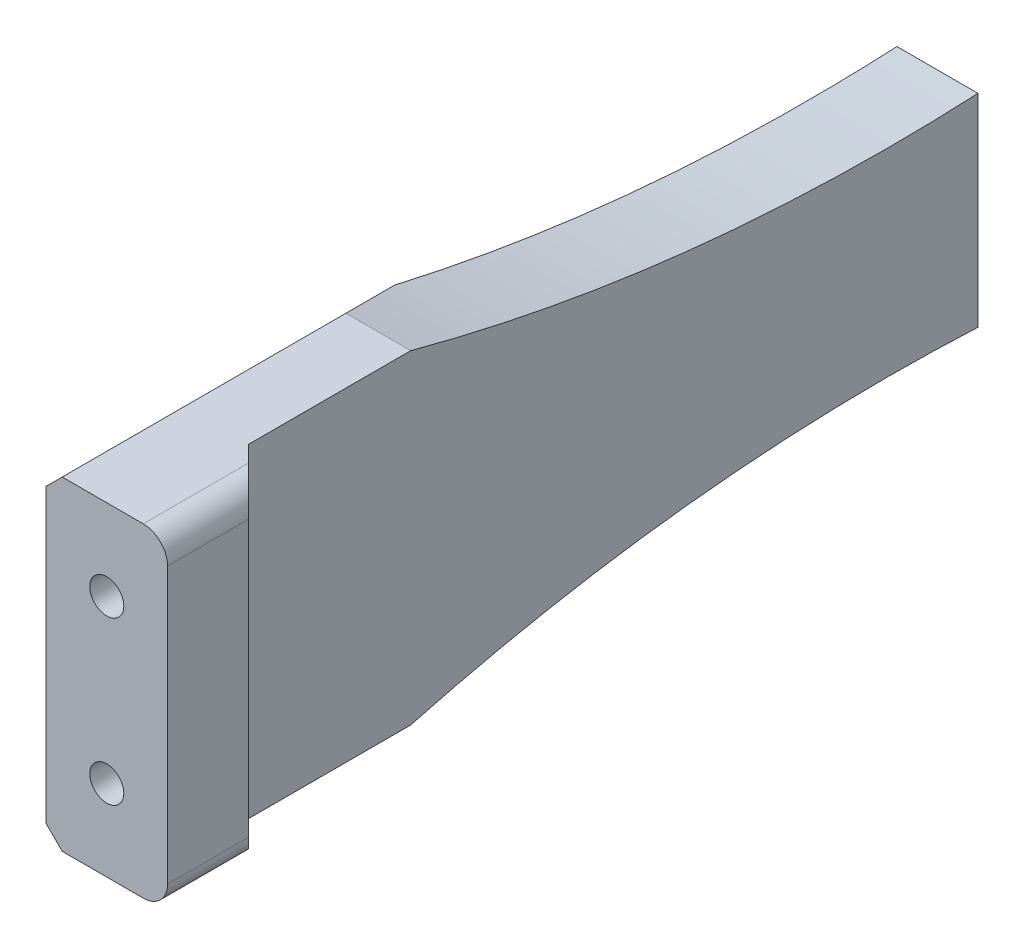
ISO-10303-21;
HEADER;
FILE_DESCRIPTION(('STEP AP214'),'2;1');
FILE_NAME('part.step','',(''),(''),'','','');
FILE_SCHEMA(('AUTOMOTIVE_DESIGN { 1 0 10303 214 1 1 1 1 }'));
ENDSEC;
DATA;
#1=APPLICATION_CONTEXT('core data for automotive mechanical design processes');
#2=APPLICATION_PROTOCOL_DEFINITION('international standard','automotive_design',2000,#1);
#3=PRODUCT_CONTEXT('',#1,'mechanical');
#4=PRODUCT('Part','Part','',(#3));
#5=PRODUCT_RELATED_PRODUCT_CATEGORY('part','',(#4));
#6=PRODUCT_DEFINITION_FORMATION('','',#4);
#7=PRODUCT_DEFINITION_CONTEXT('part definition',#1,'design');
#8=PRODUCT_DEFINITION('design','',#6,#7);
#9=PRODUCT_DEFINITION_SHAPE('','',#8);
#10=(LENGTH_UNIT() NAMED_UNIT(*) SI_UNIT(.MILLI.,.METRE.));
#11=(NAMED_UNIT(*) PLANE_ANGLE_UNIT() SI_UNIT($,.RADIAN.));
#12=(NAMED_UNIT(*) SI_UNIT($,.STERADIAN.) SOLID_ANGLE_UNIT());
#13=UNCERTAINTY_MEASURE_WITH_UNIT(LENGTH_MEASURE(1.E-05),#10,'distance_accuracy_value','');
#14=(GEOMETRIC_REPRESENTATION_CONTEXT(3) GLOBAL_UNCERTAINTY_ASSIGNED_CONTEXT((#13)) GLOBAL_UNIT_ASSIGNED_CONTEXT((#10,
#11,#12)) REPRESENTATION_CONTEXT('',''));
#15=CARTESIAN_POINT('',(0.,0.,0.));
#16=DIRECTION('',(0.,0.,1.));
#17=DIRECTION('',(1.,0.,0.));
#18=AXIS2_PLACEMENT_3D('',#15,#16,#17);
#19=CARTESIAN_POINT('',(0.,20.,-105.));
#20=DIRECTION('',(1.,0.,0.));
#21=DIRECTION('',(0.,0.,-1.));
#22=AXIS2_PLACEMENT_3D('',#19,#20,#21);
#23=PLANE('',#22);
#24=CARTESIAN_POINT('',(0.,-20.,-35.));
#25=CARTESIAN_POINT('',(0.,-10.7522879412922,-69.4763879117791));
#26=CARTESIAN_POINT('',(0.,-12.5,-105.));
#27=B_SPLINE_CURVE_WITH_KNOTS('',2,(#24,#25,#26),.UNSPECIFIED.,.F.,.F.,(3,3),(0.,1.),.UNSPECIFIED.);
#28=CARTESIAN_POINT('',(0.,-17.9999999914852,-43.023400041172));
#29=VERTEX_POINT('',#28);
#30=CARTESIAN_POINT('',(0.,-12.5,-105.));
#31=VERTEX_POINT('',#30);
#32=EDGE_CURVE('E215',#29,#31,#27,.T.);
#33=ORIENTED_EDGE('',*,*,#32,.F.);
#34=DIRECTION('',(0.,0.,1.));
#35=VECTOR('',#34,1.);
#36=CARTESIAN_POINT('',(0.,-18.,-105.));
#37=LINE('',#36,#35);
#38=CARTESIAN_POINT('',(0.,-18.,0.));
#39=VERTEX_POINT('',#38);
#40=EDGE_CURVE('E317',#29,#39,#37,.T.);
#41=ORIENTED_EDGE('',*,*,#40,.T.);
#42=DIRECTION('',(0.,-1.,0.));
#43=VECTOR('',#42,1.);
#44=CARTESIAN_POINT('',(0.,20.,0.));
#45=LINE('',#44,#43);
#46=CARTESIAN_POINT('',(0.,18.,0.));
#47=VERTEX_POINT('',#46);
#48=EDGE_CURVE('E388',#47,#39,#45,.T.);
#49=ORIENTED_EDGE('',*,*,#48,.F.);
#50=DIRECTION('',(0.,0.,-1.));
#51=VECTOR('',#50,1.);
#52=CARTESIAN_POINT('',(0.,18.,-35.));
#53=LINE('',#52,#51);
#54=CARTESIAN_POINT('',(0.,17.9999999914852,-43.023400041172));
#55=VERTEX_POINT('',#54);
#56=EDGE_CURVE('E315',#47,#55,#53,.T.);
#57=ORIENTED_EDGE('',*,*,#56,.T.);
#58=CARTESIAN_POINT('',(0.,20.,-35.));
#59=CARTESIAN_POINT('',(0.,10.7522879412922,-69.4763879117791));
#60=CARTESIAN_POINT('',(0.,12.5,-105.));
#61=B_SPLINE_CURVE_WITH_KNOTS('',2,(#58,#59,#60),.UNSPECIFIED.,.F.,.F.,(3,3),(0.,1.),.UNSPECIFIED.);
#62=CARTESIAN_POINT('',(0.,12.5,-105.));
#63=VERTEX_POINT('',#62);
#64=EDGE_CURVE('E178',#55,#63,#61,.T.);
#65=ORIENTED_EDGE('',*,*,#64,.T.);
#66=DIRECTION('',(0.,-1.,0.));
#67=VECTOR('',#66,1.);
#68=CARTESIAN_POINT('',(0.,20.,-105.));
#69=LINE('',#68,#67);
#70=EDGE_CURVE('E251',#63,#31,#69,.T.);
#71=ORIENTED_EDGE('',*,*,#70,.T.);
#72=EDGE_LOOP('',(#33,#41,#49,#57,#65,#71));
#73=FACE_BOUND('',#72,.T.);
#74=ADVANCED_FACE('F47',(#73),#23,.F.);
#75=CARTESIAN_POINT('',(10.,20.,-10.));
#76=DIRECTION('',(-1.,0.,0.));
#77=DIRECTION('',(0.,0.,1.));
#78=AXIS2_PLACEMENT_3D('',#75,#76,#77);
#79=PLANE('',#78);
#80=DIRECTION('',(0.,0.,-1.));
#81=VECTOR('',#80,1.);
#82=CARTESIAN_POINT('',(10.,20.,-10.));
#83=LINE('',#82,#81);
#84=CARTESIAN_POINT('',(10.,20.,-15.));
#85=VERTEX_POINT('',#84);
#86=CARTESIAN_POINT('',(10.,20.,-35.));
#87=VERTEX_POINT('',#86);
#88=EDGE_CURVE('E262',#85,#87,#83,.T.);
#89=ORIENTED_EDGE('',*,*,#88,.F.);
#90=DIRECTION('',(0.,-1.,0.));
#91=VECTOR('',#90,1.);
#92=CARTESIAN_POINT('',(10.,-20.,-15.));
#93=LINE('',#92,#91);
#94=CARTESIAN_POINT('',(10.,-20.,-15.));
#95=VERTEX_POINT('',#94);
#96=EDGE_CURVE('E299',#85,#95,#93,.T.);
#97=ORIENTED_EDGE('',*,*,#96,.T.);
#98=DIRECTION('',(0.,0.,-1.));
#99=VECTOR('',#98,1.);
#100=CARTESIAN_POINT('',(10.,-20.,-10.));
#101=LINE('',#100,#99);
#102=CARTESIAN_POINT('',(10.,-20.,-35.));
#103=VERTEX_POINT('',#102);
#104=EDGE_CURVE('E266',#95,#103,#101,.T.);
#105=ORIENTED_EDGE('',*,*,#104,.T.);
#106=CARTESIAN_POINT('',(10.,-20.,-35.));
#107=CARTESIAN_POINT('',(10.,-10.7522879412922,-69.4763879117791));
#108=CARTESIAN_POINT('',(10.,-12.5,-105.));
#109=B_SPLINE_CURVE_WITH_KNOTS('',2,(#106,#107,#108),.UNSPECIFIED.,.F.,.F.,(3,3),(0.,1.),.UNSPECIFIED.);
#110=CARTESIAN_POINT('',(10.,-12.5,-105.));
#111=VERTEX_POINT('',#110);
#112=EDGE_CURVE('E228',#103,#111,#109,.T.);
#113=ORIENTED_EDGE('',*,*,#112,.T.);
#114=DIRECTION('',(0.,-1.,0.));
#115=VECTOR('',#114,1.);
#116=CARTESIAN_POINT('',(10.,20.,-105.));
#117=LINE('',#116,#115);
#118=CARTESIAN_POINT('',(10.,12.5,-105.));
#119=VERTEX_POINT('',#118);
#120=EDGE_CURVE('E246',#119,#111,#117,.T.);
#121=ORIENTED_EDGE('',*,*,#120,.F.);
#122=CARTESIAN_POINT('',(10.,20.,-35.));
#123=CARTESIAN_POINT('',(10.,10.7522879412922,-69.4763879117791));
#124=CARTESIAN_POINT('',(10.,12.5,-105.));
#125=B_SPLINE_CURVE_WITH_KNOTS('',2,(#122,#123,#124),.UNSPECIFIED.,.F.,.F.,(3,3),(0.,1.),.UNSPECIFIED.);
#126=EDGE_CURVE('E211',#87,#119,#125,.T.);
#127=ORIENTED_EDGE('',*,*,#126,.F.);
#128=EDGE_LOOP('',(#89,#97,#105,#113,#121,#127));
#129=FACE_BOUND('',#128,.T.);
#130=ADVANCED_FACE('F351',(#129),#79,.F.);
#131=CARTESIAN_POINT('',(10.,20.,-105.));
#132=DIRECTION('',(0.,0.,1.));
#133=DIRECTION('',(1.,0.,0.));
#134=AXIS2_PLACEMENT_3D('',#131,#132,#133);
#135=PLANE('',#134);
#136=CARTESIAN_POINT('',(5.19500000000001,0.,-105.));
#137=DIRECTION('',(0.,0.,-1.));
#138=DIRECTION('',(-1.,0.,0.));
#139=AXIS2_PLACEMENT_3D('',#136,#137,#138);
#140=CIRCLE('',#139,2.09999999999999);
#141=CARTESIAN_POINT('',(3.09500000000002,0.,-105.));
#142=VERTEX_POINT('',#141);
#143=EDGE_CURVE('E172',#142,#142,#140,.T.);
#144=ORIENTED_EDGE('',*,*,#143,.F.);
#145=EDGE_LOOP('',(#144));
#146=FACE_BOUND('',#145,.T.);
#147=DIRECTION('',(-1.,0.,0.));
#148=VECTOR('',#147,1.);
#149=CARTESIAN_POINT('',(15.,12.5,-105.));
#150=LINE('',#149,#148);
#151=EDGE_CURVE('E385',#119,#63,#150,.T.);
#152=ORIENTED_EDGE('',*,*,#151,.F.);
#153=ORIENTED_EDGE('',*,*,#120,.T.);
#154=DIRECTION('',(-1.,0.,0.));
#155=VECTOR('',#154,1.);
#156=CARTESIAN_POINT('',(15.,-12.5,-105.));
#157=LINE('',#156,#155);
#158=EDGE_CURVE('E222',#111,#31,#157,.T.);
#159=ORIENTED_EDGE('',*,*,#158,.T.);
#160=ORIENTED_EDGE('',*,*,#70,.F.);
#161=EDGE_LOOP('',(#152,#153,#159,#160));
#162=FACE_BOUND('',#161,.T.);
#163=ADVANCED_FACE('F362',(#146,#162),#135,.F.);
#164=CARTESIAN_POINT('',(0.,20.,0.));
#165=DIRECTION('',(0.,1.,0.));
#166=DIRECTION('',(0.,0.,1.));
#167=AXIS2_PLACEMENT_3D('',#164,#165,#166);
#168=PLANE('',#167);
#169=DIRECTION('',(-1.,0.,0.));
#170=VECTOR('',#169,1.);
#171=CARTESIAN_POINT('',(15.,20.,-35.));
#172=LINE('',#171,#170);
#173=CARTESIAN_POINT('',(1.99999999999999,20.,-35.));
#174=VERTEX_POINT('',#173);
#175=EDGE_CURVE('E392',#87,#174,#172,.T.);
#176=ORIENTED_EDGE('',*,*,#175,.T.);
#177=DIRECTION('',(0.,0.,1.));
#178=VECTOR('',#177,1.);
#179=CARTESIAN_POINT('',(1.99999999999999,20.,0.));
#180=LINE('',#179,#178);
#181=CARTESIAN_POINT('',(1.99999999999999,20.,0.));
#182=VERTEX_POINT('',#181);
#183=EDGE_CURVE('E62',#174,#182,#180,.T.);
#184=ORIENTED_EDGE('',*,*,#183,.T.);
#185=DIRECTION('',(1.,0.,0.));
#186=VECTOR('',#185,1.);
#187=CARTESIAN_POINT('',(0.,20.,0.));
#188=LINE('',#187,#186);
#189=CARTESIAN_POINT('',(12.,20.,0.));
#190=VERTEX_POINT('',#189);
#191=EDGE_CURVE('E235',#182,#190,#188,.T.);
#192=ORIENTED_EDGE('',*,*,#191,.T.);
#193=DIRECTION('',(0.,0.,-1.));
#194=VECTOR('',#193,1.);
#195=CARTESIAN_POINT('',(12.,20.,-10.));
#196=LINE('',#195,#194);
#197=CARTESIAN_POINT('',(12.,20.,-13.));
#198=VERTEX_POINT('',#197);
#199=EDGE_CURVE('E280',#190,#198,#196,.T.);
#200=ORIENTED_EDGE('',*,*,#199,.T.);
#201=DIRECTION('',(0.707106781186544,0.,0.707106781186551));
#202=VECTOR('',#201,1.);
#203=CARTESIAN_POINT('',(10.,20.,-15.));
#204=LINE('',#203,#202);
#205=EDGE_CURVE('E312',#198,#85,#204,.F.);
#206=ORIENTED_EDGE('',*,*,#205,.T.);
#207=ORIENTED_EDGE('',*,*,#88,.T.);
#208=EDGE_LOOP('',(#176,#184,#192,#200,#206,#207));
#209=FACE_BOUND('',#208,.T.);
#210=ADVANCED_FACE('F204',(#209),#168,.T.);
#211=CARTESIAN_POINT('',(0.,20.,0.));
#212=DIRECTION('',(0.,0.,-1.));
#213=DIRECTION('',(-1.,0.,0.));
#214=AXIS2_PLACEMENT_3D('',#211,#212,#213);
#215=PLANE('',#214);
#216=CARTESIAN_POINT('',(7.5,-10.,0.));
#217=DIRECTION('',(0.,0.,1.));
#218=DIRECTION('',(1.,0.,0.));
#219=AXIS2_PLACEMENT_3D('',#216,#217,#218);
#220=CIRCLE('',#219,2.1);
#221=CARTESIAN_POINT('',(9.6,-10.,0.));
#222=VERTEX_POINT('',#221);
#223=EDGE_CURVE('E162',#222,#222,#220,.T.);
#224=ORIENTED_EDGE('',*,*,#223,.F.);
#225=EDGE_LOOP('',(#224));
#226=FACE_BOUND('',#225,.T.);
#227=CARTESIAN_POINT('',(7.5,10.,0.));
#228=DIRECTION('',(0.,0.,1.));
#229=DIRECTION('',(1.,0.,0.));
#230=AXIS2_PLACEMENT_3D('',#227,#228,#229);
#231=CIRCLE('',#230,2.1);
#232=CARTESIAN_POINT('',(9.6,10.,0.));
#233=VERTEX_POINT('',#232);
#234=EDGE_CURVE('E161',#233,#233,#231,.T.);
#235=ORIENTED_EDGE('',*,*,#234,.F.);
#236=EDGE_LOOP('',(#235));
#237=FACE_BOUND('',#236,.T.);
#238=ORIENTED_EDGE('',*,*,#48,.T.);
#239=DIRECTION('',(-0.70710678118655,0.707106781186545,0.));
#240=VECTOR('',#239,1.);
#241=CARTESIAN_POINT('',(0.,-18.,0.));
#242=LINE('',#241,#240);
#243=CARTESIAN_POINT('',(2.00000000000002,-20.,0.));
#244=VERTEX_POINT('',#243);
#245=EDGE_CURVE('E322',#39,#244,#242,.F.);
#246=ORIENTED_EDGE('',*,*,#245,.T.);
#247=DIRECTION('',(1.,0.,0.));
#248=VECTOR('',#247,1.);
#249=CARTESIAN_POINT('',(0.,-20.,0.));
#250=LINE('',#249,#248);
#251=CARTESIAN_POINT('',(12.,-20.,0.));
#252=VERTEX_POINT('',#251);
#253=EDGE_CURVE('E234',#244,#252,#250,.T.);
#254=ORIENTED_EDGE('',*,*,#253,.T.);
#255=CARTESIAN_POINT('',(12.,-17.,0.));
#256=DIRECTION('',(0.,0.,-1.));
#257=DIRECTION('',(-1.,0.,0.));
#258=AXIS2_PLACEMENT_3D('',#255,#256,#257);
#259=CIRCLE('',#258,3.);
#260=CARTESIAN_POINT('',(15.,-17.,0.));
#261=VERTEX_POINT('',#260);
#262=EDGE_CURVE('E292',#252,#261,#259,.F.);
#263=ORIENTED_EDGE('',*,*,#262,.T.);
#264=DIRECTION('',(0.,-1.,0.));
#265=VECTOR('',#264,1.);
#266=CARTESIAN_POINT('',(15.,20.,0.));
#267=LINE('',#266,#265);
#268=CARTESIAN_POINT('',(15.,17.,0.));
#269=VERTEX_POINT('',#268);
#270=EDGE_CURVE('E255',#269,#261,#267,.T.);
#271=ORIENTED_EDGE('',*,*,#270,.F.);
#272=CARTESIAN_POINT('',(12.,17.,0.));
#273=DIRECTION('',(0.,0.,-1.));
#274=DIRECTION('',(-1.,0.,0.));
#275=AXIS2_PLACEMENT_3D('',#272,#273,#274);
#276=CIRCLE('',#275,3.);
#277=EDGE_CURVE('E286',#269,#190,#276,.F.);
#278=ORIENTED_EDGE('',*,*,#277,.T.);
#279=ORIENTED_EDGE('',*,*,#191,.F.);
#280=DIRECTION('',(-0.707106781186545,-0.70710678118655,0.));
#281=VECTOR('',#280,1.);
#282=CARTESIAN_POINT('',(1.99999999999999,20.,0.));
#283=LINE('',#282,#281);
#284=EDGE_CURVE('E320',#182,#47,#283,.T.);
#285=ORIENTED_EDGE('',*,*,#284,.T.);
#286=EDGE_LOOP('',(#238,#246,#254,#263,#271,#278,#279,#285));
#287=FACE_BOUND('',#286,.T.);
#288=ADVANCED_FACE('F288',(#226,#237,#287),#215,.F.);
#289=CARTESIAN_POINT('',(15.,20.,0.));
#290=DIRECTION('',(-1.,0.,0.));
#291=DIRECTION('',(0.,0.,1.));
#292=AXIS2_PLACEMENT_3D('',#289,#290,#291);
#293=PLANE('',#292);
#294=ORIENTED_EDGE('',*,*,#270,.T.);
#295=DIRECTION('',(0.,0.,-1.));
#296=VECTOR('',#295,1.);
#297=CARTESIAN_POINT('',(15.,-17.,0.));
#298=LINE('',#297,#296);
#299=CARTESIAN_POINT('',(15.,-17.,-10.));
#300=VERTEX_POINT('',#299);
#301=EDGE_CURVE('E400',#261,#300,#298,.T.);
#302=ORIENTED_EDGE('',*,*,#301,.T.);
#303=DIRECTION('',(0.,-1.,0.));
#304=VECTOR('',#303,1.);
#305=CARTESIAN_POINT('',(15.,20.,-10.));
#306=LINE('',#305,#304);
#307=CARTESIAN_POINT('',(15.,17.,-10.));
#308=VERTEX_POINT('',#307);
#309=EDGE_CURVE('E250',#308,#300,#306,.T.);
#310=ORIENTED_EDGE('',*,*,#309,.F.);
#311=DIRECTION('',(0.,0.,-1.));
#312=VECTOR('',#311,1.);
#313=CARTESIAN_POINT('',(15.,17.,0.));
#314=LINE('',#313,#312);
#315=EDGE_CURVE('E398',#308,#269,#314,.F.);
#316=ORIENTED_EDGE('',*,*,#315,.T.);
#317=EDGE_LOOP('',(#294,#302,#310,#316));
#318=FACE_BOUND('',#317,.T.);
#319=ADVANCED_FACE('F355',(#318),#293,.F.);
#320=CARTESIAN_POINT('',(0.,-20.,0.));
#321=DIRECTION('',(0.,1.,0.));
#322=DIRECTION('',(0.,0.,1.));
#323=AXIS2_PLACEMENT_3D('',#320,#321,#322);
#324=PLANE('',#323);
#325=ORIENTED_EDGE('',*,*,#253,.F.);
#326=DIRECTION('',(0.,0.,-1.));
#327=VECTOR('',#326,1.);
#328=CARTESIAN_POINT('',(2.00000000000002,-20.,0.));
#329=LINE('',#328,#327);
#330=CARTESIAN_POINT('',(2.00000000000002,-20.,-35.));
#331=VERTEX_POINT('',#330);
#332=EDGE_CURVE('E75',#244,#331,#329,.T.);
#333=ORIENTED_EDGE('',*,*,#332,.T.);
#334=DIRECTION('',(-1.,0.,0.));
#335=VECTOR('',#334,1.);
#336=CARTESIAN_POINT('',(15.,-20.,-35.));
#337=LINE('',#336,#335);
#338=EDGE_CURVE('E375',#331,#103,#337,.F.);
#339=ORIENTED_EDGE('',*,*,#338,.T.);
#340=ORIENTED_EDGE('',*,*,#104,.F.);
#341=DIRECTION('',(-0.707106781186544,0.,-0.707106781186551));
#342=VECTOR('',#341,1.);
#343=CARTESIAN_POINT('',(12.5000000000001,-20.,-12.5));
#344=LINE('',#343,#342);
#345=CARTESIAN_POINT('',(12.,-20.,-13.));
#346=VERTEX_POINT('',#345);
#347=EDGE_CURVE('E302',#95,#346,#344,.F.);
#348=ORIENTED_EDGE('',*,*,#347,.T.);
#349=DIRECTION('',(0.,0.,-1.));
#350=VECTOR('',#349,1.);
#351=CARTESIAN_POINT('',(12.,-20.,0.));
#352=LINE('',#351,#350);
#353=EDGE_CURVE('E293',#346,#252,#352,.F.);
#354=ORIENTED_EDGE('',*,*,#353,.T.);
#355=EDGE_LOOP('',(#325,#333,#339,#340,#348,#354));
#356=FACE_BOUND('',#355,.T.);
#357=ADVANCED_FACE('F202',(#356),#324,.F.);
#358=CARTESIAN_POINT('',(15.,-20.,-35.));
#359=CARTESIAN_POINT('',(15.,-10.7522879412922,-69.4763879117791));
#360=CARTESIAN_POINT('',(15.,-12.5,-105.));
#361=B_SPLINE_CURVE_WITH_KNOTS('',2,(#358,#359,#360),.UNSPECIFIED.,.F.,.F.,(3,3),(0.,1.),.UNSPECIFIED.);
#362=DIRECTION('',(-1.,0.,0.));
#363=VECTOR('',#362,1.);
#364=SURFACE_OF_LINEAR_EXTRUSION('',#361,#363);
#365=ORIENTED_EDGE('',*,*,#338,.F.);
#366=CARTESIAN_POINT('',(2.00000000000002,-20.,-35.));
#367=CARTESIAN_POINT('',(1.91108064927385,-19.9110806492738,-35.3315000632081));
#368=CARTESIAN_POINT('',(1.82284486769539,-19.8228448676954,-35.6633669129893));
#369=CARTESIAN_POINT('',(1.64775987118841,-19.6477598711884,-36.3277914835694));
#370=CARTESIAN_POINT('',(1.56091051111002,-19.56091051111,-36.6603491278716));
#371=CARTESIAN_POINT('',(1.38860515109107,-19.3886051510911,-37.3261588452846));
#372=CARTESIAN_POINT('',(1.30314905274411,-19.3031490527441,-37.6594108674598));
#373=CARTESIAN_POINT('',(1.13363704527744,-19.1336370452774,-38.3266128624954));
#374=CARTESIAN_POINT('',(1.04958108592077,-19.0495810859208,-38.6605628098283));
#375=CARTESIAN_POINT('',(0.882876102191676,-18.8828761021917,-39.3291648171915));
#376=CARTESIAN_POINT('',(0.800227079679187,-18.8002270796792,-39.6638168781494));
#377=CARTESIAN_POINT('',(0.6363431268262,-18.6363431268262,-40.333825883261));
#378=CARTESIAN_POINT('',(0.55510824594005,-18.55510824594,-40.6691828516085));
#379=CARTESIAN_POINT('',(0.394059646176462,-18.3940596461765,-41.34060507407));
#380=CARTESIAN_POINT('',(0.314246028278227,-18.3142460282782,-41.6766703766282));
#381=CARTESIAN_POINT('',(0.15604704921862,-18.1560470492186,-42.3495126315151));
#382=CARTESIAN_POINT('',(0.0776618420296097,-18.0776618420296,-42.6862896562466));
#383=CARTESIAN_POINT('',(-7.98037144645414E-09,-17.9999999920196,-43.0234000388524));
#384=B_SPLINE_CURVE_WITH_KNOTS('',3,(#366,#367,#368,#369,#370,#371,#372,#373,#374,#375,#376,
#377,#378,#379,#380,#381,#382,#383),.UNSPECIFIED.,.F.,.F.,(4,2,2,2,2,2,2,2,4),(0.,
1.06364813494265,2.12718417228192,3.19064476354196,4.25406711532225,5.31749087281539,
6.38095174519276,7.44448787625524,8.50813797868263),.UNSPECIFIED.);
#385=EDGE_CURVE('E324',#331,#29,#384,.T.);
#386=ORIENTED_EDGE('',*,*,#385,.T.);
#387=ORIENTED_EDGE('',*,*,#32,.T.);
#388=ORIENTED_EDGE('',*,*,#158,.F.);
#389=ORIENTED_EDGE('',*,*,#112,.F.);
#390=EDGE_LOOP('',(#365,#386,#387,#388,#389));
#391=FACE_BOUND('',#390,.T.);
#392=ADVANCED_FACE('F195',(#391),#364,.F.);
#393=CARTESIAN_POINT('',(15.,20.,-35.));
#394=CARTESIAN_POINT('',(15.,10.7522879412922,-69.4763879117791));
#395=CARTESIAN_POINT('',(15.,12.5,-105.));
#396=B_SPLINE_CURVE_WITH_KNOTS('',2,(#393,#394,#395),.UNSPECIFIED.,.F.,.F.,(3,3),(0.,1.),.UNSPECIFIED.);
#397=DIRECTION('',(-1.,0.,0.));
#398=VECTOR('',#397,1.);
#399=SURFACE_OF_LINEAR_EXTRUSION('',#396,#398);
#400=ORIENTED_EDGE('',*,*,#64,.F.);
#401=CARTESIAN_POINT('',(0.,18.,-43.0234000431336));
#402=CARTESIAN_POINT('',(0.0776618448309332,18.0776618448309,-42.68628965806));
#403=CARTESIAN_POINT('',(0.156047049902395,18.1560470499024,-42.3495126322859));
#404=CARTESIAN_POINT('',(0.314246027418779,18.3142460274188,-41.6766703766049));
#405=CARTESIAN_POINT('',(0.394059645890902,18.3940596458909,-41.340605074295));
#406=CARTESIAN_POINT('',(0.555108246079236,18.5551082460792,-40.6691828519936));
#407=CARTESIAN_POINT('',(0.636343126816294,18.6363431268163,-40.3338258835578));
#408=CARTESIAN_POINT('',(0.800227079564997,18.800227079565,-39.6638168783599));
#409=CARTESIAN_POINT('',(0.882876102122289,18.8828761021223,-39.3291648174039));
#410=CARTESIAN_POINT('',(1.04958108588711,19.0495810858871,-38.6605628100291));
#411=CARTESIAN_POINT('',(1.13363704523467,19.1336370452347,-38.3266128626826));
#412=CARTESIAN_POINT('',(1.30314905269847,19.3031490526985,-37.6594108676206));
#413=CARTESIAN_POINT('',(1.38860515105167,19.3886051510517,-37.3261588454326));
#414=CARTESIAN_POINT('',(1.56091051108124,19.5609105110812,-36.6603491279869));
#415=CARTESIAN_POINT('',(1.64775987116401,19.647759871164,-36.3277914836647));
#416=CARTESIAN_POINT('',(1.82284486768142,19.8228448676814,-35.6633669130393));
#417=CARTESIAN_POINT('',(1.91108064926593,19.9110806492659,-35.3315000632327));
#418=CARTESIAN_POINT('',(1.99999999999999,20.,-35.));
#419=B_SPLINE_CURVE_WITH_KNOTS('',3,(#401,#402,#403,#404,#405,#406,#407,#408,#409,#410,#411,
#412,#413,#414,#415,#416,#417,#418),.UNSPECIFIED.,.F.,.F.,(4,2,2,2,2,2,2,2,4),(0.,
1.06365010258961,2.1271862337057,3.19064710613684,4.25407086368382,5.31749321549082,
6.3809538067955,7.4444898441974,8.50813797922061),.UNSPECIFIED.);
#420=EDGE_CURVE('E12',#55,#174,#419,.T.);
#421=ORIENTED_EDGE('',*,*,#420,.T.);
#422=ORIENTED_EDGE('',*,*,#175,.F.);
#423=ORIENTED_EDGE('',*,*,#126,.T.);
#424=ORIENTED_EDGE('',*,*,#151,.T.);
#425=EDGE_LOOP('',(#400,#421,#422,#423,#424));
#426=FACE_BOUND('',#425,.T.);
#427=ADVANCED_FACE('F189',(#426),#399,.T.);
#428=CARTESIAN_POINT('',(12.,-17.,0.));
#429=DIRECTION('',(0.,0.,-1.));
#430=DIRECTION('',(-1.,0.,0.));
#431=AXIS2_PLACEMENT_3D('',#428,#429,#430);
#432=CYLINDRICAL_SURFACE('',#431,3.);
#433=ORIENTED_EDGE('',*,*,#262,.F.);
#434=ORIENTED_EDGE('',*,*,#353,.F.);
#435=CARTESIAN_POINT('',(12.,-17.,-13.));
#436=DIRECTION('',(0.707106781186551,0.,-0.707106781186544));
#437=DIRECTION('',(-0.707106781186544,0.,-0.707106781186551));
#438=AXIS2_PLACEMENT_3D('',#435,#436,#437);
#439=ELLIPSE('',#438,4.2426406871193,3.);
#440=EDGE_CURVE('E309',#346,#300,#439,.F.);
#441=ORIENTED_EDGE('',*,*,#440,.T.);
#442=ORIENTED_EDGE('',*,*,#301,.F.);
#443=EDGE_LOOP('',(#433,#434,#441,#442));
#444=FACE_BOUND('',#443,.T.);
#445=ADVANCED_FACE('F194',(#444),#432,.T.);
#446=CARTESIAN_POINT('',(12.,17.,0.));
#447=DIRECTION('',(0.,0.,1.));
#448=DIRECTION('',(1.,0.,0.));
#449=AXIS2_PLACEMENT_3D('',#446,#447,#448);
#450=CYLINDRICAL_SURFACE('',#449,3.);
#451=ORIENTED_EDGE('',*,*,#277,.F.);
#452=ORIENTED_EDGE('',*,*,#315,.F.);
#453=CARTESIAN_POINT('',(12.,17.,-13.));
#454=DIRECTION('',(0.707106781186551,0.,-0.707106781186544));
#455=DIRECTION('',(0.707106781186544,0.,0.707106781186551));
#456=AXIS2_PLACEMENT_3D('',#453,#454,#455);
#457=ELLIPSE('',#456,4.2426406871193,3.);
#458=EDGE_CURVE('E297',#308,#198,#457,.F.);
#459=ORIENTED_EDGE('',*,*,#458,.T.);
#460=ORIENTED_EDGE('',*,*,#199,.F.);
#461=EDGE_LOOP('',(#451,#452,#459,#460));
#462=FACE_BOUND('',#461,.T.);
#463=ADVANCED_FACE('F295',(#462),#450,.T.);
#464=CARTESIAN_POINT('',(5.19500000000001,0.,-91.2618072999579));
#465=DIRECTION('',(0.,0.,-1.));
#466=DIRECTION('',(-1.,0.,0.));
#467=AXIS2_PLACEMENT_3D('',#464,#465,#466);
#468=CONICAL_SURFACE('',#467,2.1,1.02974425867665);
#469=CARTESIAN_POINT('',(5.19500000000001,0.,-90.));
#470=VERTEX_POINT('',#469);
#471=VERTEX_LOOP('',#470);
#472=FACE_BOUND('',#471,.T.);
#473=CARTESIAN_POINT('',(5.19500000000001,0.,-91.2618072999579));
#474=DIRECTION('',(0.,0.,-1.));
#475=DIRECTION('',(-1.,0.,0.));
#476=AXIS2_PLACEMENT_3D('',#473,#474,#475);
#477=CIRCLE('',#476,2.1);
#478=CARTESIAN_POINT('',(3.09500000000001,0.,-91.2618072999579));
#479=VERTEX_POINT('',#478);
#480=EDGE_CURVE('E175',#479,#479,#477,.T.);
#481=ORIENTED_EDGE('',*,*,#480,.T.);
#482=EDGE_LOOP('',(#481));
#483=FACE_BOUND('',#482,.T.);
#484=ADVANCED_FACE('F196',(#472,#483),#468,.F.);
#485=CARTESIAN_POINT('',(5.19500000000001,0.,-105.));
#486=DIRECTION('',(0.,0.,-1.));
#487=DIRECTION('',(-1.,0.,0.));
#488=AXIS2_PLACEMENT_3D('',#485,#486,#487);
#489=CYLINDRICAL_SURFACE('',#488,2.09999999999999);
#490=ORIENTED_EDGE('',*,*,#480,.F.);
#491=EDGE_LOOP('',(#490));
#492=FACE_BOUND('',#491,.T.);
#493=ORIENTED_EDGE('',*,*,#143,.T.);
#494=EDGE_LOOP('',(#493));
#495=FACE_BOUND('',#494,.T.);
#496=ADVANCED_FACE('F433',(#492,#495),#489,.F.);
#497=CARTESIAN_POINT('',(7.5,10.,-13.7381927000421));
#498=DIRECTION('',(0.,0.,1.));
#499=DIRECTION('',(1.,0.,0.));
#500=AXIS2_PLACEMENT_3D('',#497,#498,#499);
#501=CONICAL_SURFACE('',#500,2.1,1.02974425867665);
#502=CARTESIAN_POINT('',(7.5,10.,-15.));
#503=VERTEX_POINT('',#502);
#504=VERTEX_LOOP('',#503);
#505=FACE_BOUND('',#504,.T.);
#506=CARTESIAN_POINT('',(7.5,10.,-13.7381927000421));
#507=DIRECTION('',(0.,0.,1.));
#508=DIRECTION('',(1.,0.,0.));
#509=AXIS2_PLACEMENT_3D('',#506,#507,#508);
#510=CIRCLE('',#509,2.1);
#511=CARTESIAN_POINT('',(9.6,10.,-13.7381927000421));
#512=VERTEX_POINT('',#511);
#513=EDGE_CURVE('E165',#512,#512,#510,.T.);
#514=ORIENTED_EDGE('',*,*,#513,.T.);
#515=EDGE_LOOP('',(#514));
#516=FACE_BOUND('',#515,.T.);
#517=ADVANCED_FACE('F442',(#505,#516),#501,.F.);
#518=CARTESIAN_POINT('',(7.5,10.,0.));
#519=DIRECTION('',(0.,0.,1.));
#520=DIRECTION('',(1.,0.,0.));
#521=AXIS2_PLACEMENT_3D('',#518,#519,#520);
#522=CYLINDRICAL_SURFACE('',#521,2.1);
#523=ORIENTED_EDGE('',*,*,#513,.F.);
#524=EDGE_LOOP('',(#523));
#525=FACE_BOUND('',#524,.T.);
#526=ORIENTED_EDGE('',*,*,#234,.T.);
#527=EDGE_LOOP('',(#526));
#528=FACE_BOUND('',#527,.T.);
#529=ADVANCED_FACE('F155',(#525,#528),#522,.F.);
#530=CARTESIAN_POINT('',(7.5,-10.,-13.7381927000421));
#531=DIRECTION('',(0.,0.,1.));
#532=DIRECTION('',(1.,0.,0.));
#533=AXIS2_PLACEMENT_3D('',#530,#531,#532);
#534=CONICAL_SURFACE('',#533,2.1,1.02974425867665);
#535=CARTESIAN_POINT('',(7.5,-10.,-15.));
#536=VERTEX_POINT('',#535);
#537=VERTEX_LOOP('',#536);
#538=FACE_BOUND('',#537,.T.);
#539=CARTESIAN_POINT('',(7.5,-10.,-13.7381927000421));
#540=DIRECTION('',(0.,0.,1.));
#541=DIRECTION('',(1.,0.,0.));
#542=AXIS2_PLACEMENT_3D('',#539,#540,#541);
#543=CIRCLE('',#542,2.1);
#544=CARTESIAN_POINT('',(9.6,-10.,-13.7381927000421));
#545=VERTEX_POINT('',#544);
#546=EDGE_CURVE('E159',#545,#545,#543,.T.);
#547=ORIENTED_EDGE('',*,*,#546,.T.);
#548=EDGE_LOOP('',(#547));
#549=FACE_BOUND('',#548,.T.);
#550=ADVANCED_FACE('F151',(#538,#549),#534,.F.);
#551=CARTESIAN_POINT('',(7.5,-10.,0.));
#552=DIRECTION('',(0.,0.,1.));
#553=DIRECTION('',(1.,0.,0.));
#554=AXIS2_PLACEMENT_3D('',#551,#552,#553);
#555=CYLINDRICAL_SURFACE('',#554,2.1);
#556=ORIENTED_EDGE('',*,*,#546,.F.);
#557=EDGE_LOOP('',(#556));
#558=FACE_BOUND('',#557,.T.);
#559=ORIENTED_EDGE('',*,*,#223,.T.);
#560=EDGE_LOOP('',(#559));
#561=FACE_BOUND('',#560,.T.);
#562=ADVANCED_FACE('F154',(#558,#561),#555,.F.);
#563=CARTESIAN_POINT('',(10.,20.,-15.));
#564=DIRECTION('',(0.707106781186551,0.,-0.707106781186544));
#565=DIRECTION('',(0.,1.,0.));
#566=AXIS2_PLACEMENT_3D('',#563,#564,#565);
#567=PLANE('',#566);
#568=ORIENTED_EDGE('',*,*,#458,.F.);
#569=ORIENTED_EDGE('',*,*,#309,.T.);
#570=ORIENTED_EDGE('',*,*,#440,.F.);
#571=ORIENTED_EDGE('',*,*,#347,.F.);
#572=ORIENTED_EDGE('',*,*,#96,.F.);
#573=ORIENTED_EDGE('',*,*,#205,.F.);
#574=EDGE_LOOP('',(#568,#569,#570,#571,#572,#573));
#575=FACE_BOUND('',#574,.T.);
#576=ADVANCED_FACE('F337',(#575),#567,.T.);
#577=CARTESIAN_POINT('',(0.,-18.,-105.));
#578=DIRECTION('',(0.707106781186545,0.70710678118655,0.));
#579=DIRECTION('',(0.,0.,1.));
#580=AXIS2_PLACEMENT_3D('',#577,#578,#579);
#581=PLANE('',#580);
#582=ORIENTED_EDGE('',*,*,#385,.F.);
#583=ORIENTED_EDGE('',*,*,#332,.F.);
#584=ORIENTED_EDGE('',*,*,#245,.F.);
#585=ORIENTED_EDGE('',*,*,#40,.F.);
#586=EDGE_LOOP('',(#582,#583,#584,#585));
#587=FACE_BOUND('',#586,.T.);
#588=ADVANCED_FACE('F330',(#587),#581,.F.);
#589=CARTESIAN_POINT('',(1.99999999999999,20.,0.));
#590=DIRECTION('',(-0.70710678118655,0.707106781186545,0.));
#591=DIRECTION('',(0.,0.,-1.));
#592=AXIS2_PLACEMENT_3D('',#589,#590,#591);
#593=PLANE('',#592);
#594=ORIENTED_EDGE('',*,*,#420,.F.);
#595=ORIENTED_EDGE('',*,*,#56,.F.);
#596=ORIENTED_EDGE('',*,*,#284,.F.);
#597=ORIENTED_EDGE('',*,*,#183,.F.);
#598=EDGE_LOOP('',(#594,#595,#596,#597));
#599=FACE_BOUND('',#598,.T.);
#600=ADVANCED_FACE('F50',(#599),#593,.T.);
#601=CLOSED_SHELL('',(#74,#130,#163,#210,#288,#319,#357,#392,#427,#445,#463,#484,#496,#517,#529,
#550,#562,#576,#588,#600));
#602=MANIFOLD_SOLID_BREP('B2',#601);
#603=ADVANCED_BREP_SHAPE_REPRESENTATION('',(#18,#602),#14);
#604=SHAPE_DEFINITION_REPRESENTATION(#9,#603);
ENDSEC;
END-ISO-10303-21;
